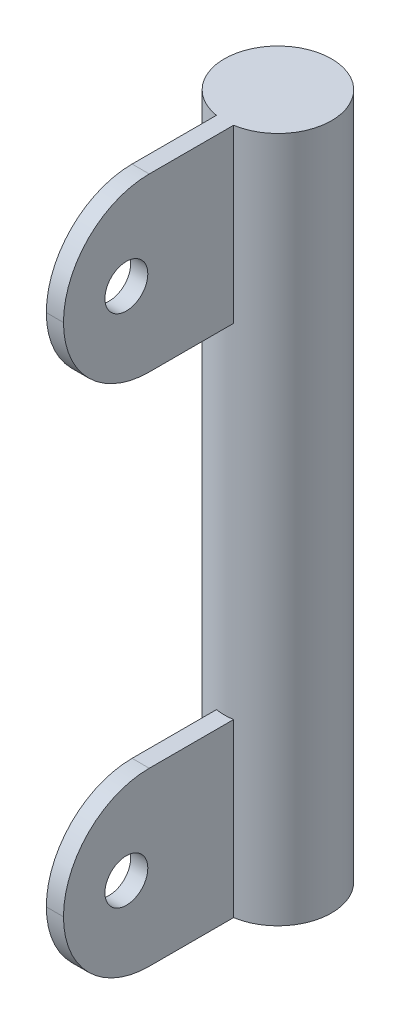
ISO-10303-21;
HEADER;
FILE_DESCRIPTION(('STEP AP214'),'2;1');
FILE_NAME('part.step','',(''),(''),'','','');
FILE_SCHEMA(('AUTOMOTIVE_DESIGN { 1 0 10303 214 1 1 1 1 }'));
ENDSEC;
DATA;
#1=APPLICATION_CONTEXT('core data for automotive mechanical design processes');
#2=APPLICATION_PROTOCOL_DEFINITION('international standard','automotive_design',2000,#1);
#3=PRODUCT_CONTEXT('',#1,'mechanical');
#4=PRODUCT('Part','Part','',(#3));
#5=PRODUCT_RELATED_PRODUCT_CATEGORY('part','',(#4));
#6=PRODUCT_DEFINITION_FORMATION('','',#4);
#7=PRODUCT_DEFINITION_CONTEXT('part definition',#1,'design');
#8=PRODUCT_DEFINITION('design','',#6,#7);
#9=PRODUCT_DEFINITION_SHAPE('','',#8);
#10=(LENGTH_UNIT() NAMED_UNIT(*) SI_UNIT(.MILLI.,.METRE.));
#11=(NAMED_UNIT(*) PLANE_ANGLE_UNIT() SI_UNIT($,.RADIAN.));
#12=(NAMED_UNIT(*) SI_UNIT($,.STERADIAN.) SOLID_ANGLE_UNIT());
#13=UNCERTAINTY_MEASURE_WITH_UNIT(LENGTH_MEASURE(1.E-05),#10,'distance_accuracy_value','');
#14=(GEOMETRIC_REPRESENTATION_CONTEXT(3) GLOBAL_UNCERTAINTY_ASSIGNED_CONTEXT((#13)) GLOBAL_UNIT_ASSIGNED_CONTEXT((#10,
#11,#12)) REPRESENTATION_CONTEXT('',''));
#15=CARTESIAN_POINT('',(0.,0.,0.));
#16=DIRECTION('',(0.,0.,1.));
#17=DIRECTION('',(1.,0.,0.));
#18=AXIS2_PLACEMENT_3D('',#15,#16,#17);
#19=CARTESIAN_POINT('',(0.,160.,0.));
#20=DIRECTION('',(0.,-1.,0.));
#21=DIRECTION('',(0.,0.,-1.));
#22=AXIS2_PLACEMENT_3D('',#19,#20,#21);
#23=CYLINDRICAL_SURFACE('',#22,12.5);
#24=DIRECTION('',(0.,-1.,0.));
#25=VECTOR('',#24,1.);
#26=CARTESIAN_POINT('',(-2.,160.,12.3389626792531));
#27=LINE('',#26,#25);
#28=CARTESIAN_POINT('',(-2.,160.,12.3389626792531));
#29=VERTEX_POINT('',#28);
#30=CARTESIAN_POINT('',(-2.,120.,12.3389626792531));
#31=VERTEX_POINT('',#30);
#32=EDGE_CURVE('E130',#29,#31,#27,.T.);
#33=ORIENTED_EDGE('',*,*,#32,.F.);
#34=CARTESIAN_POINT('',(0.,160.,0.));
#35=DIRECTION('',(0.,1.,0.));
#36=DIRECTION('',(0.,0.,1.));
#37=AXIS2_PLACEMENT_3D('',#34,#35,#36);
#38=CIRCLE('',#37,12.5);
#39=CARTESIAN_POINT('',(2.,160.,12.3389626792531));
#40=VERTEX_POINT('',#39);
#41=EDGE_CURVE('E129',#40,#29,#38,.T.);
#42=ORIENTED_EDGE('',*,*,#41,.F.);
#43=DIRECTION('',(0.,-1.,0.));
#44=VECTOR('',#43,1.);
#45=CARTESIAN_POINT('',(2.,160.,12.3389626792531));
#46=LINE('',#45,#44);
#47=CARTESIAN_POINT('',(2.,120.,12.3389626792531));
#48=VERTEX_POINT('',#47);
#49=EDGE_CURVE('E136',#40,#48,#46,.T.);
#50=ORIENTED_EDGE('',*,*,#49,.T.);
#51=CARTESIAN_POINT('',(0.,120.,0.));
#52=DIRECTION('',(0.,1.,0.));
#53=DIRECTION('',(0.,0.,1.));
#54=AXIS2_PLACEMENT_3D('',#51,#52,#53);
#55=CIRCLE('',#54,12.5);
#56=EDGE_CURVE('E133',#31,#48,#55,.T.);
#57=ORIENTED_EDGE('',*,*,#56,.F.);
#58=EDGE_LOOP('',(#33,#42,#50,#57));
#59=FACE_BOUND('',#58,.T.);
#60=DIRECTION('',(0.,-1.,0.));
#61=VECTOR('',#60,1.);
#62=CARTESIAN_POINT('',(2.00000000000002,160.,12.3389626792531));
#63=LINE('',#62,#61);
#64=CARTESIAN_POINT('',(2.,0.,12.3389626792531));
#65=VERTEX_POINT('',#64);
#66=CARTESIAN_POINT('',(2.,40.,12.3389626792531));
#67=VERTEX_POINT('',#66);
#68=EDGE_CURVE('E124',#65,#67,#63,.F.);
#69=ORIENTED_EDGE('',*,*,#68,.F.);
#70=CARTESIAN_POINT('',(0.,0.,0.));
#71=DIRECTION('',(0.,1.,0.));
#72=DIRECTION('',(0.,0.,1.));
#73=AXIS2_PLACEMENT_3D('',#70,#71,#72);
#74=CIRCLE('',#73,12.5);
#75=CARTESIAN_POINT('',(-2.,0.,12.3389626792531));
#76=VERTEX_POINT('',#75);
#77=EDGE_CURVE('E113',#65,#76,#74,.T.);
#78=ORIENTED_EDGE('',*,*,#77,.T.);
#79=DIRECTION('',(0.,-1.,0.));
#80=VECTOR('',#79,1.);
#81=CARTESIAN_POINT('',(-1.99999999999998,160.,12.3389626792531));
#82=LINE('',#81,#80);
#83=CARTESIAN_POINT('',(-1.99999999999998,40.,12.3389626792531));
#84=VERTEX_POINT('',#83);
#85=EDGE_CURVE('E118',#76,#84,#82,.F.);
#86=ORIENTED_EDGE('',*,*,#85,.T.);
#87=CARTESIAN_POINT('',(0.,40.,0.));
#88=DIRECTION('',(0.,1.,0.));
#89=DIRECTION('',(0.,0.,1.));
#90=AXIS2_PLACEMENT_3D('',#87,#88,#89);
#91=CIRCLE('',#90,12.5);
#92=EDGE_CURVE('E154',#84,#67,#91,.T.);
#93=ORIENTED_EDGE('',*,*,#92,.T.);
#94=EDGE_LOOP('',(#69,#78,#86,#93));
#95=FACE_BOUND('',#94,.T.);
#96=ADVANCED_FACE('F33',(#59,#95),#23,.T.);
#97=CARTESIAN_POINT('',(0.,160.,0.));
#98=DIRECTION('',(0.,1.,0.));
#99=DIRECTION('',(0.,0.,1.));
#100=AXIS2_PLACEMENT_3D('',#97,#98,#99);
#101=PLANE('',#100);
#102=DIRECTION('',(0.,0.,-1.));
#103=VECTOR('',#102,1.);
#104=CARTESIAN_POINT('',(-2.,160.,52.));
#105=LINE('',#104,#103);
#106=CARTESIAN_POINT('',(-2.,160.,32.));
#107=VERTEX_POINT('',#106);
#108=EDGE_CURVE('E191',#107,#29,#105,.T.);
#109=ORIENTED_EDGE('',*,*,#108,.F.);
#110=DIRECTION('',(1.,0.,0.));
#111=VECTOR('',#110,1.);
#112=CARTESIAN_POINT('',(2.,160.,32.));
#113=LINE('',#112,#111);
#114=CARTESIAN_POINT('',(2.,160.,32.));
#115=VERTEX_POINT('',#114);
#116=EDGE_CURVE('E152',#107,#115,#113,.T.);
#117=ORIENTED_EDGE('',*,*,#116,.T.);
#118=DIRECTION('',(0.,0.,-1.));
#119=VECTOR('',#118,1.);
#120=CARTESIAN_POINT('',(2.,160.,52.));
#121=LINE('',#120,#119);
#122=EDGE_CURVE('E158',#115,#40,#121,.T.);
#123=ORIENTED_EDGE('',*,*,#122,.T.);
#124=ORIENTED_EDGE('',*,*,#41,.T.);
#125=EDGE_LOOP('',(#109,#117,#123,#124));
#126=FACE_BOUND('',#125,.T.);
#127=ADVANCED_FACE('F218',(#126),#101,.T.);
#128=CARTESIAN_POINT('',(0.,0.,0.));
#129=DIRECTION('',(0.,1.,0.));
#130=DIRECTION('',(0.,0.,1.));
#131=AXIS2_PLACEMENT_3D('',#128,#129,#130);
#132=PLANE('',#131);
#133=DIRECTION('',(0.,0.,-1.));
#134=VECTOR('',#133,1.);
#135=CARTESIAN_POINT('',(2.,0.,52.));
#136=LINE('',#135,#134);
#137=CARTESIAN_POINT('',(2.,0.,32.));
#138=VERTEX_POINT('',#137);
#139=EDGE_CURVE('E125',#138,#65,#136,.T.);
#140=ORIENTED_EDGE('',*,*,#139,.F.);
#141=DIRECTION('',(1.,0.,0.));
#142=VECTOR('',#141,1.);
#143=CARTESIAN_POINT('',(0.,0.,32.));
#144=LINE('',#143,#142);
#145=CARTESIAN_POINT('',(-2.,0.,32.));
#146=VERTEX_POINT('',#145);
#147=EDGE_CURVE('E11',#138,#146,#144,.F.);
#148=ORIENTED_EDGE('',*,*,#147,.T.);
#149=DIRECTION('',(0.,0.,-1.));
#150=VECTOR('',#149,1.);
#151=CARTESIAN_POINT('',(-2.,0.,52.));
#152=LINE('',#151,#150);
#153=EDGE_CURVE('E109',#146,#76,#152,.T.);
#154=ORIENTED_EDGE('',*,*,#153,.T.);
#155=ORIENTED_EDGE('',*,*,#77,.F.);
#156=EDGE_LOOP('',(#140,#148,#154,#155));
#157=FACE_BOUND('',#156,.T.);
#158=ADVANCED_FACE('F111',(#157),#132,.F.);
#159=CARTESIAN_POINT('',(-2.,160.,52.));
#160=DIRECTION('',(1.,0.,0.));
#161=DIRECTION('',(0.,1.,0.));
#162=AXIS2_PLACEMENT_3D('',#159,#160,#161);
#163=PLANE('',#162);
#164=CARTESIAN_POINT('',(-2.,140.,37.3389626792531));
#165=DIRECTION('',(1.,0.,0.));
#166=DIRECTION('',(0.,1.,0.));
#167=AXIS2_PLACEMENT_3D('',#164,#165,#166);
#168=CIRCLE('',#167,5.00000000000001);
#169=CARTESIAN_POINT('',(-2.,145.,37.3389626792531));
#170=VERTEX_POINT('',#169);
#171=EDGE_CURVE('E159',#170,#170,#168,.T.);
#172=ORIENTED_EDGE('',*,*,#171,.T.);
#173=EDGE_LOOP('',(#172));
#174=FACE_BOUND('',#173,.T.);
#175=DIRECTION('',(0.,0.,-1.));
#176=VECTOR('',#175,1.);
#177=CARTESIAN_POINT('',(-2.,120.,52.));
#178=LINE('',#177,#176);
#179=CARTESIAN_POINT('',(-2.,120.,32.));
#180=VERTEX_POINT('',#179);
#181=EDGE_CURVE('E193',#180,#31,#178,.T.);
#182=ORIENTED_EDGE('',*,*,#181,.F.);
#183=CARTESIAN_POINT('',(-2.,140.,32.));
#184=DIRECTION('',(1.,0.,0.));
#185=DIRECTION('',(0.,1.,0.));
#186=AXIS2_PLACEMENT_3D('',#183,#184,#185);
#187=CIRCLE('',#186,20.);
#188=CARTESIAN_POINT('',(-2.,140.,52.));
#189=VERTEX_POINT('',#188);
#190=EDGE_CURVE('E150',#180,#189,#187,.F.);
#191=ORIENTED_EDGE('',*,*,#190,.T.);
#192=CARTESIAN_POINT('',(-2.,140.,32.));
#193=DIRECTION('',(1.,0.,0.));
#194=DIRECTION('',(0.,1.,0.));
#195=AXIS2_PLACEMENT_3D('',#192,#193,#194);
#196=CIRCLE('',#195,20.);
#197=EDGE_CURVE('E148',#189,#107,#196,.F.);
#198=ORIENTED_EDGE('',*,*,#197,.T.);
#199=ORIENTED_EDGE('',*,*,#108,.T.);
#200=ORIENTED_EDGE('',*,*,#32,.T.);
#201=EDGE_LOOP('',(#182,#191,#198,#199,#200));
#202=FACE_BOUND('',#201,.T.);
#203=ADVANCED_FACE('F215',(#174,#202),#163,.F.);
#204=CARTESIAN_POINT('',(2.,160.,52.));
#205=DIRECTION('',(1.,0.,0.));
#206=DIRECTION('',(0.,1.,0.));
#207=AXIS2_PLACEMENT_3D('',#204,#205,#206);
#208=PLANE('',#207);
#209=CARTESIAN_POINT('',(2.,140.,37.3389626792531));
#210=DIRECTION('',(1.,0.,0.));
#211=DIRECTION('',(0.,1.,0.));
#212=AXIS2_PLACEMENT_3D('',#209,#210,#211);
#213=CIRCLE('',#212,5.00000000000001);
#214=CARTESIAN_POINT('',(2.,145.,37.3389626792531));
#215=VERTEX_POINT('',#214);
#216=EDGE_CURVE('E186',#215,#215,#213,.T.);
#217=ORIENTED_EDGE('',*,*,#216,.F.);
#218=EDGE_LOOP('',(#217));
#219=FACE_BOUND('',#218,.T.);
#220=CARTESIAN_POINT('',(2.,140.,32.));
#221=DIRECTION('',(1.,0.,0.));
#222=DIRECTION('',(0.,1.,0.));
#223=AXIS2_PLACEMENT_3D('',#220,#221,#222);
#224=CIRCLE('',#223,20.);
#225=CARTESIAN_POINT('',(2.,140.,52.));
#226=VERTEX_POINT('',#225);
#227=EDGE_CURVE('E141',#115,#226,#224,.T.);
#228=ORIENTED_EDGE('',*,*,#227,.T.);
#229=CARTESIAN_POINT('',(2.,140.,32.));
#230=DIRECTION('',(1.,0.,0.));
#231=DIRECTION('',(0.,1.,0.));
#232=AXIS2_PLACEMENT_3D('',#229,#230,#231);
#233=CIRCLE('',#232,20.);
#234=CARTESIAN_POINT('',(2.,120.,32.));
#235=VERTEX_POINT('',#234);
#236=EDGE_CURVE('E143',#226,#235,#233,.T.);
#237=ORIENTED_EDGE('',*,*,#236,.T.);
#238=DIRECTION('',(0.,0.,-1.));
#239=VECTOR('',#238,1.);
#240=CARTESIAN_POINT('',(2.,120.,52.));
#241=LINE('',#240,#239);
#242=EDGE_CURVE('E195',#235,#48,#241,.T.);
#243=ORIENTED_EDGE('',*,*,#242,.T.);
#244=ORIENTED_EDGE('',*,*,#49,.F.);
#245=ORIENTED_EDGE('',*,*,#122,.F.);
#246=EDGE_LOOP('',(#228,#237,#243,#244,#245));
#247=FACE_BOUND('',#246,.T.);
#248=ADVANCED_FACE('F206',(#219,#247),#208,.T.);
#249=CARTESIAN_POINT('',(-2.,120.,52.));
#250=DIRECTION('',(0.,1.,0.));
#251=DIRECTION('',(0.,0.,1.));
#252=AXIS2_PLACEMENT_3D('',#249,#250,#251);
#253=PLANE('',#252);
#254=ORIENTED_EDGE('',*,*,#242,.F.);
#255=DIRECTION('',(1.,0.,0.));
#256=VECTOR('',#255,1.);
#257=CARTESIAN_POINT('',(-2.,120.,32.));
#258=LINE('',#257,#256);
#259=EDGE_CURVE('E145',#235,#180,#258,.F.);
#260=ORIENTED_EDGE('',*,*,#259,.T.);
#261=ORIENTED_EDGE('',*,*,#181,.T.);
#262=ORIENTED_EDGE('',*,*,#56,.T.);
#263=EDGE_LOOP('',(#254,#260,#261,#262));
#264=FACE_BOUND('',#263,.T.);
#265=ADVANCED_FACE('F212',(#264),#253,.F.);
#266=CARTESIAN_POINT('',(0.,140.,32.));
#267=DIRECTION('',(-1.,0.,0.));
#268=DIRECTION('',(0.,0.,1.));
#269=AXIS2_PLACEMENT_3D('',#266,#267,#268);
#270=CYLINDRICAL_SURFACE('',#269,20.);
#271=ORIENTED_EDGE('',*,*,#116,.F.);
#272=ORIENTED_EDGE('',*,*,#197,.F.);
#273=DIRECTION('',(1.,0.,0.));
#274=VECTOR('',#273,1.);
#275=CARTESIAN_POINT('',(-2.,140.,52.));
#276=LINE('',#275,#274);
#277=EDGE_CURVE('E155',#226,#189,#276,.F.);
#278=ORIENTED_EDGE('',*,*,#277,.F.);
#279=ORIENTED_EDGE('',*,*,#227,.F.);
#280=EDGE_LOOP('',(#271,#272,#278,#279));
#281=FACE_BOUND('',#280,.T.);
#282=ADVANCED_FACE('F222',(#281),#270,.T.);
#283=CARTESIAN_POINT('',(0.,140.,32.));
#284=DIRECTION('',(1.,0.,0.));
#285=DIRECTION('',(0.,0.,-1.));
#286=AXIS2_PLACEMENT_3D('',#283,#284,#285);
#287=CYLINDRICAL_SURFACE('',#286,20.);
#288=ORIENTED_EDGE('',*,*,#190,.F.);
#289=ORIENTED_EDGE('',*,*,#259,.F.);
#290=ORIENTED_EDGE('',*,*,#236,.F.);
#291=ORIENTED_EDGE('',*,*,#277,.T.);
#292=EDGE_LOOP('',(#288,#289,#290,#291));
#293=FACE_BOUND('',#292,.T.);
#294=ADVANCED_FACE('F225',(#293),#287,.T.);
#295=CARTESIAN_POINT('',(-12.5,140.,37.3389626792531));
#296=DIRECTION('',(1.,0.,0.));
#297=DIRECTION('',(0.,1.,0.));
#298=AXIS2_PLACEMENT_3D('',#295,#296,#297);
#299=CYLINDRICAL_SURFACE('',#298,5.00000000000001);
#300=ORIENTED_EDGE('',*,*,#216,.T.);
#301=EDGE_LOOP('',(#300));
#302=FACE_BOUND('',#301,.T.);
#303=ORIENTED_EDGE('',*,*,#171,.F.);
#304=EDGE_LOOP('',(#303));
#305=FACE_BOUND('',#304,.T.);
#306=ADVANCED_FACE('F227',(#302,#305),#299,.F.);
#307=CARTESIAN_POINT('',(2.,0.,52.));
#308=DIRECTION('',(-1.,0.,0.));
#309=DIRECTION('',(0.,-1.,0.));
#310=AXIS2_PLACEMENT_3D('',#307,#308,#309);
#311=PLANE('',#310);
#312=CARTESIAN_POINT('',(2.,20.,37.3389626792531));
#313=DIRECTION('',(-1.,0.,0.));
#314=DIRECTION('',(0.,-1.,0.));
#315=AXIS2_PLACEMENT_3D('',#312,#313,#314);
#316=CIRCLE('',#315,5.00000000000001);
#317=CARTESIAN_POINT('',(2.,15.,37.3389626792531));
#318=VERTEX_POINT('',#317);
#319=EDGE_CURVE('E173',#318,#318,#316,.T.);
#320=ORIENTED_EDGE('',*,*,#319,.T.);
#321=EDGE_LOOP('',(#320));
#322=FACE_BOUND('',#321,.T.);
#323=DIRECTION('',(0.,0.,-1.));
#324=VECTOR('',#323,1.);
#325=CARTESIAN_POINT('',(2.,40.,52.));
#326=LINE('',#325,#324);
#327=CARTESIAN_POINT('',(2.,40.,32.));
#328=VERTEX_POINT('',#327);
#329=EDGE_CURVE('E182',#328,#67,#326,.T.);
#330=ORIENTED_EDGE('',*,*,#329,.F.);
#331=CARTESIAN_POINT('',(2.,20.,32.));
#332=DIRECTION('',(-1.,0.,0.));
#333=DIRECTION('',(0.,-1.,0.));
#334=AXIS2_PLACEMENT_3D('',#331,#332,#333);
#335=CIRCLE('',#334,20.);
#336=CARTESIAN_POINT('',(2.,20.,52.));
#337=VERTEX_POINT('',#336);
#338=EDGE_CURVE('E166',#328,#337,#335,.F.);
#339=ORIENTED_EDGE('',*,*,#338,.T.);
#340=CARTESIAN_POINT('',(2.,20.,32.));
#341=DIRECTION('',(-1.,0.,0.));
#342=DIRECTION('',(0.,-1.,0.));
#343=AXIS2_PLACEMENT_3D('',#340,#341,#342);
#344=CIRCLE('',#343,20.);
#345=EDGE_CURVE('E164',#337,#138,#344,.F.);
#346=ORIENTED_EDGE('',*,*,#345,.T.);
#347=ORIENTED_EDGE('',*,*,#139,.T.);
#348=ORIENTED_EDGE('',*,*,#68,.T.);
#349=EDGE_LOOP('',(#330,#339,#346,#347,#348));
#350=FACE_BOUND('',#349,.T.);
#351=ADVANCED_FACE('F233',(#322,#350),#311,.F.);
#352=CARTESIAN_POINT('',(-2.,0.,52.));
#353=DIRECTION('',(-1.,0.,0.));
#354=DIRECTION('',(0.,-1.,0.));
#355=AXIS2_PLACEMENT_3D('',#352,#353,#354);
#356=PLANE('',#355);
#357=CARTESIAN_POINT('',(-2.,20.,37.3389626792531));
#358=DIRECTION('',(-1.,0.,0.));
#359=DIRECTION('',(0.,-1.,0.));
#360=AXIS2_PLACEMENT_3D('',#357,#358,#359);
#361=CIRCLE('',#360,5.00000000000001);
#362=CARTESIAN_POINT('',(-2.,15.,37.3389626792531));
#363=VERTEX_POINT('',#362);
#364=EDGE_CURVE('E37',#363,#363,#361,.F.);
#365=ORIENTED_EDGE('',*,*,#364,.T.);
#366=EDGE_LOOP('',(#365));
#367=FACE_BOUND('',#366,.T.);
#368=CARTESIAN_POINT('',(-2.,20.,32.));
#369=DIRECTION('',(-1.,0.,0.));
#370=DIRECTION('',(0.,-1.,0.));
#371=AXIS2_PLACEMENT_3D('',#368,#369,#370);
#372=CIRCLE('',#371,20.);
#373=CARTESIAN_POINT('',(-2.,20.,52.));
#374=VERTEX_POINT('',#373);
#375=EDGE_CURVE('E50',#146,#374,#372,.T.);
#376=ORIENTED_EDGE('',*,*,#375,.T.);
#377=CARTESIAN_POINT('',(-2.,20.,32.));
#378=DIRECTION('',(-1.,0.,0.));
#379=DIRECTION('',(0.,-1.,0.));
#380=AXIS2_PLACEMENT_3D('',#377,#378,#379);
#381=CIRCLE('',#380,20.);
#382=CARTESIAN_POINT('',(-2.,40.,32.));
#383=VERTEX_POINT('',#382);
#384=EDGE_CURVE('E42',#374,#383,#381,.T.);
#385=ORIENTED_EDGE('',*,*,#384,.T.);
#386=DIRECTION('',(0.,0.,-1.));
#387=VECTOR('',#386,1.);
#388=CARTESIAN_POINT('',(-2.,40.,52.));
#389=LINE('',#388,#387);
#390=EDGE_CURVE('E114',#383,#84,#389,.T.);
#391=ORIENTED_EDGE('',*,*,#390,.T.);
#392=ORIENTED_EDGE('',*,*,#85,.F.);
#393=ORIENTED_EDGE('',*,*,#153,.F.);
#394=EDGE_LOOP('',(#376,#385,#391,#392,#393));
#395=FACE_BOUND('',#394,.T.);
#396=ADVANCED_FACE('F119',(#367,#395),#356,.T.);
#397=CARTESIAN_POINT('',(-2.,40.,52.));
#398=DIRECTION('',(0.,1.,0.));
#399=DIRECTION('',(0.,0.,1.));
#400=AXIS2_PLACEMENT_3D('',#397,#398,#399);
#401=PLANE('',#400);
#402=ORIENTED_EDGE('',*,*,#390,.F.);
#403=DIRECTION('',(1.,0.,0.));
#404=VECTOR('',#403,1.);
#405=CARTESIAN_POINT('',(2.,40.,32.));
#406=LINE('',#405,#404);
#407=EDGE_CURVE('E161',#383,#328,#406,.T.);
#408=ORIENTED_EDGE('',*,*,#407,.T.);
#409=ORIENTED_EDGE('',*,*,#329,.T.);
#410=ORIENTED_EDGE('',*,*,#92,.F.);
#411=EDGE_LOOP('',(#402,#408,#409,#410));
#412=FACE_BOUND('',#411,.T.);
#413=ADVANCED_FACE('F256',(#412),#401,.T.);
#414=CARTESIAN_POINT('',(0.,20.,32.));
#415=DIRECTION('',(1.,0.,0.));
#416=DIRECTION('',(0.,0.,-1.));
#417=AXIS2_PLACEMENT_3D('',#414,#415,#416);
#418=CYLINDRICAL_SURFACE('',#417,20.);
#419=DIRECTION('',(1.,0.,0.));
#420=VECTOR('',#419,1.);
#421=CARTESIAN_POINT('',(0.,20.,52.));
#422=LINE('',#421,#420);
#423=EDGE_CURVE('E115',#374,#337,#422,.T.);
#424=ORIENTED_EDGE('',*,*,#423,.F.);
#425=ORIENTED_EDGE('',*,*,#375,.F.);
#426=ORIENTED_EDGE('',*,*,#147,.F.);
#427=ORIENTED_EDGE('',*,*,#345,.F.);
#428=EDGE_LOOP('',(#424,#425,#426,#427));
#429=FACE_BOUND('',#428,.T.);
#430=ADVANCED_FACE('F35',(#429),#418,.T.);
#431=CARTESIAN_POINT('',(-2.,20.,32.));
#432=DIRECTION('',(-1.,0.,0.));
#433=DIRECTION('',(0.,0.,1.));
#434=AXIS2_PLACEMENT_3D('',#431,#432,#433);
#435=CYLINDRICAL_SURFACE('',#434,20.);
#436=ORIENTED_EDGE('',*,*,#384,.F.);
#437=ORIENTED_EDGE('',*,*,#423,.T.);
#438=ORIENTED_EDGE('',*,*,#338,.F.);
#439=ORIENTED_EDGE('',*,*,#407,.F.);
#440=EDGE_LOOP('',(#436,#437,#438,#439));
#441=FACE_BOUND('',#440,.T.);
#442=ADVANCED_FACE('F264',(#441),#435,.T.);
#443=CARTESIAN_POINT('',(-12.5,20.,37.3389626792531));
#444=DIRECTION('',(1.,0.,0.));
#445=DIRECTION('',(0.,1.,0.));
#446=AXIS2_PLACEMENT_3D('',#443,#444,#445);
#447=CYLINDRICAL_SURFACE('',#446,5.00000000000001);
#448=ORIENTED_EDGE('',*,*,#364,.F.);
#449=EDGE_LOOP('',(#448));
#450=FACE_BOUND('',#449,.T.);
#451=ORIENTED_EDGE('',*,*,#319,.F.);
#452=EDGE_LOOP('',(#451));
#453=FACE_BOUND('',#452,.T.);
#454=ADVANCED_FACE('F262',(#450,#453),#447,.F.);
#455=CLOSED_SHELL('',(#96,#127,#158,#203,#248,#265,#282,#294,#306,#351,#396,#413,#430,#442,#454));
#456=MANIFOLD_SOLID_BREP('B2',#455);
#457=ADVANCED_BREP_SHAPE_REPRESENTATION('',(#18,#456),#14);
#458=SHAPE_DEFINITION_REPRESENTATION(#9,#457);
ENDSEC;
END-ISO-10303-21;
